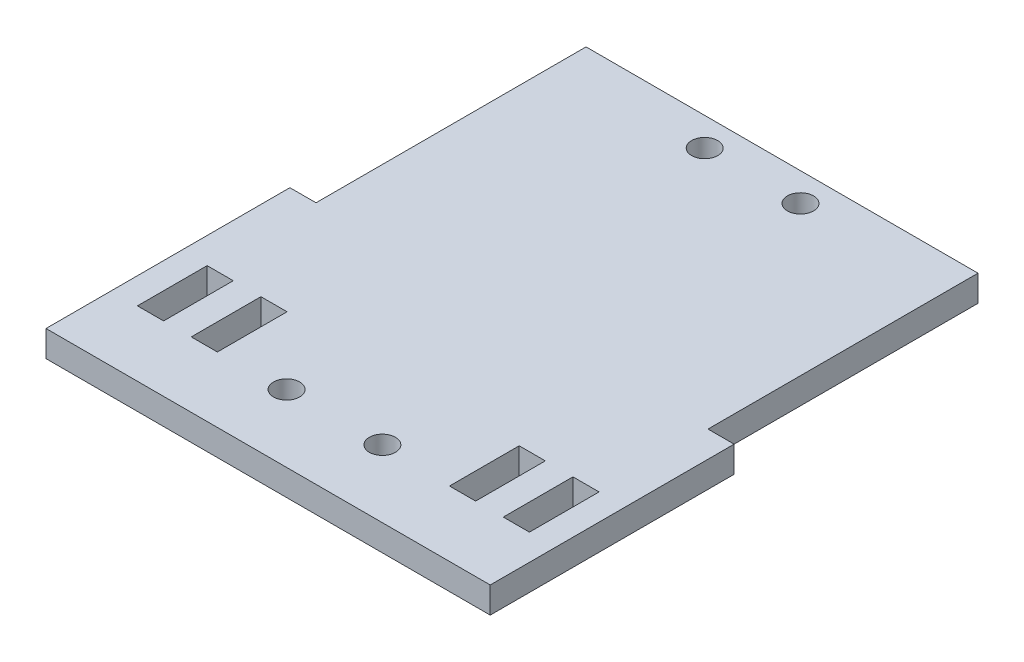
ISO-10303-21;
HEADER;
FILE_DESCRIPTION(('STEP AP214'),'2;1');
FILE_NAME('part.step','',(''),(''),'','','');
FILE_SCHEMA(('AUTOMOTIVE_DESIGN { 1 0 10303 214 1 1 1 1 }'));
ENDSEC;
DATA;
#1=APPLICATION_CONTEXT('core data for automotive mechanical design processes');
#2=APPLICATION_PROTOCOL_DEFINITION('international standard','automotive_design',2000,#1);
#3=PRODUCT_CONTEXT('',#1,'mechanical');
#4=PRODUCT('Part','Part','',(#3));
#5=PRODUCT_RELATED_PRODUCT_CATEGORY('part','',(#4));
#6=PRODUCT_DEFINITION_FORMATION('','',#4);
#7=PRODUCT_DEFINITION_CONTEXT('part definition',#1,'design');
#8=PRODUCT_DEFINITION('design','',#6,#7);
#9=PRODUCT_DEFINITION_SHAPE('','',#8);
#10=(LENGTH_UNIT() NAMED_UNIT(*) SI_UNIT(.MILLI.,.METRE.));
#11=(NAMED_UNIT(*) PLANE_ANGLE_UNIT() SI_UNIT($,.RADIAN.));
#12=(NAMED_UNIT(*) SI_UNIT($,.STERADIAN.) SOLID_ANGLE_UNIT());
#13=UNCERTAINTY_MEASURE_WITH_UNIT(LENGTH_MEASURE(1.E-05),#10,'distance_accuracy_value','');
#14=(GEOMETRIC_REPRESENTATION_CONTEXT(3) GLOBAL_UNCERTAINTY_ASSIGNED_CONTEXT((#13)) GLOBAL_UNIT_ASSIGNED_CONTEXT((#10,
#11,#12)) REPRESENTATION_CONTEXT('',''));
#15=CARTESIAN_POINT('',(0.,0.,0.));
#16=DIRECTION('',(0.,0.,1.));
#17=DIRECTION('',(1.,0.,0.));
#18=AXIS2_PLACEMENT_3D('',#15,#16,#17);
#19=CARTESIAN_POINT('',(110.,4.,0.));
#20=DIRECTION('',(0.,1.,0.));
#21=DIRECTION('',(0.,0.,1.));
#22=AXIS2_PLACEMENT_3D('',#19,#20,#21);
#23=PLANE('',#22);
#24=DIRECTION('',(0.,0.,-1.));
#25=VECTOR('',#24,1.);
#26=CARTESIAN_POINT('',(4.,4.,-56.));
#27=LINE('',#26,#25);
#28=CARTESIAN_POINT('',(4.00000000000001,4.,0.));
#29=VERTEX_POINT('',#28);
#30=CARTESIAN_POINT('',(4.,4.,-56.));
#31=VERTEX_POINT('',#30);
#32=EDGE_CURVE('E208',#29,#31,#27,.T.);
#33=ORIENTED_EDGE('',*,*,#32,.F.);
#34=DIRECTION('',(1.,0.,0.));
#35=VECTOR('',#34,1.);
#36=CARTESIAN_POINT('',(0.,4.,0.));
#37=LINE('',#36,#35);
#38=CARTESIAN_POINT('',(106.,4.,0.));
#39=VERTEX_POINT('',#38);
#40=EDGE_CURVE('E220',#29,#39,#37,.T.);
#41=ORIENTED_EDGE('',*,*,#40,.T.);
#42=DIRECTION('',(0.,0.,1.));
#43=VECTOR('',#42,1.);
#44=CARTESIAN_POINT('',(106.,4.,-56.));
#45=LINE('',#44,#43);
#46=CARTESIAN_POINT('',(106.,4.,-56.));
#47=VERTEX_POINT('',#46);
#48=EDGE_CURVE('E224',#47,#39,#45,.T.);
#49=ORIENTED_EDGE('',*,*,#48,.F.);
#50=DIRECTION('',(1.,0.,0.));
#51=VECTOR('',#50,1.);
#52=CARTESIAN_POINT('',(100.,4.,-56.));
#53=LINE('',#52,#51);
#54=CARTESIAN_POINT('',(100.,4.,-56.));
#55=VERTEX_POINT('',#54);
#56=EDGE_CURVE('E258',#55,#47,#53,.T.);
#57=ORIENTED_EDGE('',*,*,#56,.F.);
#58=DIRECTION('',(0.,0.,1.));
#59=VECTOR('',#58,1.);
#60=CARTESIAN_POINT('',(100.,4.,-56.));
#61=LINE('',#60,#59);
#62=CARTESIAN_POINT('',(100.,4.,-118.));
#63=VERTEX_POINT('',#62);
#64=EDGE_CURVE('E377',#63,#55,#61,.T.);
#65=ORIENTED_EDGE('',*,*,#64,.F.);
#66=DIRECTION('',(-1.,0.,0.));
#67=VECTOR('',#66,1.);
#68=CARTESIAN_POINT('',(0.,4.,-118.));
#69=LINE('',#68,#67);
#70=CARTESIAN_POINT('',(10.,4.,-118.));
#71=VERTEX_POINT('',#70);
#72=EDGE_CURVE('E228',#63,#71,#69,.T.);
#73=ORIENTED_EDGE('',*,*,#72,.T.);
#74=DIRECTION('',(0.,0.,-1.));
#75=VECTOR('',#74,1.);
#76=CARTESIAN_POINT('',(10.,4.,-118.));
#77=LINE('',#76,#75);
#78=CARTESIAN_POINT('',(10.,4.,-56.));
#79=VERTEX_POINT('',#78);
#80=EDGE_CURVE('E400',#79,#71,#77,.T.);
#81=ORIENTED_EDGE('',*,*,#80,.F.);
#82=DIRECTION('',(1.,0.,0.));
#83=VECTOR('',#82,1.);
#84=CARTESIAN_POINT('',(0.,4.,-56.));
#85=LINE('',#84,#83);
#86=EDGE_CURVE('E222',#31,#79,#85,.T.);
#87=ORIENTED_EDGE('',*,*,#86,.F.);
#88=EDGE_LOOP('',(#33,#41,#49,#57,#65,#73,#81,#87));
#89=FACE_BOUND('',#88,.T.);
#90=DIRECTION('',(0.,0.,1.));
#91=VECTOR('',#90,1.);
#92=CARTESIAN_POINT('',(94.,4.,-31.));
#93=LINE('',#92,#91);
#94=CARTESIAN_POINT('',(94.,4.,-31.));
#95=VERTEX_POINT('',#94);
#96=CARTESIAN_POINT('',(94.,4.,-15.));
#97=VERTEX_POINT('',#96);
#98=EDGE_CURVE('E349',#95,#97,#93,.T.);
#99=ORIENTED_EDGE('',*,*,#98,.F.);
#100=DIRECTION('',(-1.,0.,0.));
#101=VECTOR('',#100,1.);
#102=CARTESIAN_POINT('',(94.,4.,-31.));
#103=LINE('',#102,#101);
#104=CARTESIAN_POINT('',(100.,4.,-31.));
#105=VERTEX_POINT('',#104);
#106=EDGE_CURVE('E367',#105,#95,#103,.T.);
#107=ORIENTED_EDGE('',*,*,#106,.F.);
#108=DIRECTION('',(0.,0.,-1.));
#109=VECTOR('',#108,1.);
#110=CARTESIAN_POINT('',(100.,4.,-31.));
#111=LINE('',#110,#109);
#112=CARTESIAN_POINT('',(100.,4.,-15.));
#113=VERTEX_POINT('',#112);
#114=EDGE_CURVE('E381',#113,#105,#111,.T.);
#115=ORIENTED_EDGE('',*,*,#114,.F.);
#116=DIRECTION('',(1.,0.,0.));
#117=VECTOR('',#116,1.);
#118=CARTESIAN_POINT('',(94.,4.,-15.));
#119=LINE('',#118,#117);
#120=EDGE_CURVE('E385',#97,#113,#119,.T.);
#121=ORIENTED_EDGE('',*,*,#120,.F.);
#122=EDGE_LOOP('',(#99,#107,#115,#121));
#123=FACE_BOUND('',#122,.T.);
#124=DIRECTION('',(0.,0.,1.));
#125=VECTOR('',#124,1.);
#126=CARTESIAN_POINT('',(81.65,4.,-31.));
#127=LINE('',#126,#125);
#128=CARTESIAN_POINT('',(81.65,4.,-31.));
#129=VERTEX_POINT('',#128);
#130=CARTESIAN_POINT('',(81.65,4.,-15.));
#131=VERTEX_POINT('',#130);
#132=EDGE_CURVE('E321',#129,#131,#127,.T.);
#133=ORIENTED_EDGE('',*,*,#132,.F.);
#134=DIRECTION('',(-1.,0.,0.));
#135=VECTOR('',#134,1.);
#136=CARTESIAN_POINT('',(81.65,4.,-31.));
#137=LINE('',#136,#135);
#138=CARTESIAN_POINT('',(87.65,4.,-31.));
#139=VERTEX_POINT('',#138);
#140=EDGE_CURVE('E339',#139,#129,#137,.T.);
#141=ORIENTED_EDGE('',*,*,#140,.F.);
#142=DIRECTION('',(0.,0.,-1.));
#143=VECTOR('',#142,1.);
#144=CARTESIAN_POINT('',(87.65,4.,-31.));
#145=LINE('',#144,#143);
#146=CARTESIAN_POINT('',(87.65,4.,-15.));
#147=VERTEX_POINT('',#146);
#148=EDGE_CURVE('E353',#147,#139,#145,.T.);
#149=ORIENTED_EDGE('',*,*,#148,.F.);
#150=DIRECTION('',(1.,0.,0.));
#151=VECTOR('',#150,1.);
#152=CARTESIAN_POINT('',(81.65,4.,-15.));
#153=LINE('',#152,#151);
#154=EDGE_CURVE('E357',#131,#147,#153,.T.);
#155=ORIENTED_EDGE('',*,*,#154,.F.);
#156=EDGE_LOOP('',(#133,#141,#149,#155));
#157=FACE_BOUND('',#156,.T.);
#158=DIRECTION('',(0.,0.,1.));
#159=VECTOR('',#158,1.);
#160=CARTESIAN_POINT('',(22.35,4.,-31.));
#161=LINE('',#160,#159);
#162=CARTESIAN_POINT('',(22.35,4.,-31.));
#163=VERTEX_POINT('',#162);
#164=CARTESIAN_POINT('',(22.35,4.,-15.));
#165=VERTEX_POINT('',#164);
#166=EDGE_CURVE('E292',#163,#165,#161,.T.);
#167=ORIENTED_EDGE('',*,*,#166,.F.);
#168=DIRECTION('',(-1.,0.,0.));
#169=VECTOR('',#168,1.);
#170=CARTESIAN_POINT('',(22.35,4.,-31.));
#171=LINE('',#170,#169);
#172=CARTESIAN_POINT('',(28.35,4.,-31.));
#173=VERTEX_POINT('',#172);
#174=EDGE_CURVE('E311',#173,#163,#171,.T.);
#175=ORIENTED_EDGE('',*,*,#174,.F.);
#176=DIRECTION('',(0.,0.,-1.));
#177=VECTOR('',#176,1.);
#178=CARTESIAN_POINT('',(28.35,4.,-31.));
#179=LINE('',#178,#177);
#180=CARTESIAN_POINT('',(28.35,4.,-15.));
#181=VERTEX_POINT('',#180);
#182=EDGE_CURVE('E325',#181,#173,#179,.T.);
#183=ORIENTED_EDGE('',*,*,#182,.F.);
#184=DIRECTION('',(1.,0.,0.));
#185=VECTOR('',#184,1.);
#186=CARTESIAN_POINT('',(22.35,4.,-15.));
#187=LINE('',#186,#185);
#188=EDGE_CURVE('E329',#165,#181,#187,.T.);
#189=ORIENTED_EDGE('',*,*,#188,.F.);
#190=EDGE_LOOP('',(#167,#175,#183,#189));
#191=FACE_BOUND('',#190,.T.);
#192=DIRECTION('',(0.,0.,1.));
#193=VECTOR('',#192,1.);
#194=CARTESIAN_POINT('',(10.,4.,-31.));
#195=LINE('',#194,#193);
#196=CARTESIAN_POINT('',(10.,4.,-31.));
#197=VERTEX_POINT('',#196);
#198=CARTESIAN_POINT('',(10.,4.,-15.));
#199=VERTEX_POINT('',#198);
#200=EDGE_CURVE('E304',#197,#199,#195,.T.);
#201=ORIENTED_EDGE('',*,*,#200,.F.);
#202=DIRECTION('',(-1.,0.,0.));
#203=VECTOR('',#202,1.);
#204=CARTESIAN_POINT('',(10.,4.,-31.));
#205=LINE('',#204,#203);
#206=CARTESIAN_POINT('',(16.,4.,-31.));
#207=VERTEX_POINT('',#206);
#208=EDGE_CURVE('E282',#207,#197,#205,.T.);
#209=ORIENTED_EDGE('',*,*,#208,.F.);
#210=DIRECTION('',(0.,0.,-1.));
#211=VECTOR('',#210,1.);
#212=CARTESIAN_POINT('',(16.,4.,-31.));
#213=LINE('',#212,#211);
#214=CARTESIAN_POINT('',(16.,4.,-15.));
#215=VERTEX_POINT('',#214);
#216=EDGE_CURVE('E296',#215,#207,#213,.T.);
#217=ORIENTED_EDGE('',*,*,#216,.F.);
#218=DIRECTION('',(1.,0.,0.));
#219=VECTOR('',#218,1.);
#220=CARTESIAN_POINT('',(10.,4.,-15.));
#221=LINE('',#220,#219);
#222=EDGE_CURVE('E300',#199,#215,#221,.T.);
#223=ORIENTED_EDGE('',*,*,#222,.F.);
#224=EDGE_LOOP('',(#201,#209,#217,#223));
#225=FACE_BOUND('',#224,.T.);
#226=CARTESIAN_POINT('',(43.7468145088074,4.,-15.4936290176147));
#227=DIRECTION('',(0.,-1.,0.));
#228=DIRECTION('',(0.,0.,-1.));
#229=AXIS2_PLACEMENT_3D('',#226,#227,#228);
#230=CIRCLE('',#229,3.00000000000001);
#231=CARTESIAN_POINT('',(43.7468145088074,4.,-18.4936290176147));
#232=VERTEX_POINT('',#231);
#233=EDGE_CURVE('E229',#232,#232,#230,.T.);
#234=ORIENTED_EDGE('',*,*,#233,.T.);
#235=EDGE_LOOP('',(#234));
#236=FACE_BOUND('',#235,.T.);
#237=CARTESIAN_POINT('',(65.7468145088074,4.,-111.493629017615));
#238=DIRECTION('',(0.,-1.,0.));
#239=DIRECTION('',(0.,0.,-1.));
#240=AXIS2_PLACEMENT_3D('',#237,#238,#239);
#241=CIRCLE('',#240,2.99999999999996);
#242=CARTESIAN_POINT('',(65.7468145088074,4.,-114.493629017615));
#243=VERTEX_POINT('',#242);
#244=EDGE_CURVE('E237',#243,#243,#241,.T.);
#245=ORIENTED_EDGE('',*,*,#244,.T.);
#246=EDGE_LOOP('',(#245));
#247=FACE_BOUND('',#246,.T.);
#248=CARTESIAN_POINT('',(43.7468145088074,4.,-111.493629017615));
#249=DIRECTION('',(0.,-1.,0.));
#250=DIRECTION('',(0.,0.,-1.));
#251=AXIS2_PLACEMENT_3D('',#248,#249,#250);
#252=CIRCLE('',#251,3.00000000000001);
#253=CARTESIAN_POINT('',(43.7468145088074,4.,-114.493629017615));
#254=VERTEX_POINT('',#253);
#255=EDGE_CURVE('E411',#254,#254,#252,.T.);
#256=ORIENTED_EDGE('',*,*,#255,.T.);
#257=EDGE_LOOP('',(#256));
#258=FACE_BOUND('',#257,.T.);
#259=CARTESIAN_POINT('',(65.7468145088074,4.,-15.4936290176147));
#260=DIRECTION('',(0.,-1.,0.));
#261=DIRECTION('',(0.,0.,-1.));
#262=AXIS2_PLACEMENT_3D('',#259,#260,#261);
#263=CIRCLE('',#262,2.99999999999998);
#264=CARTESIAN_POINT('',(65.7468145088074,4.,-18.4936290176147));
#265=VERTEX_POINT('',#264);
#266=EDGE_CURVE('E406',#265,#265,#263,.T.);
#267=ORIENTED_EDGE('',*,*,#266,.T.);
#268=EDGE_LOOP('',(#267));
#269=FACE_BOUND('',#268,.T.);
#270=ADVANCED_FACE('F47',(#89,#123,#157,#191,#225,#236,#247,#258,#269),#23,.T.);
#271=CARTESIAN_POINT('',(0.,4.,0.));
#272=DIRECTION('',(0.,0.,-1.));
#273=DIRECTION('',(-1.,0.,0.));
#274=AXIS2_PLACEMENT_3D('',#271,#272,#273);
#275=PLANE('',#274);
#276=ORIENTED_EDGE('',*,*,#40,.F.);
#277=DIRECTION('',(0.,1.,0.));
#278=VECTOR('',#277,1.);
#279=CARTESIAN_POINT('',(4.00000000000001,-6.,0.));
#280=LINE('',#279,#278);
#281=CARTESIAN_POINT('',(4.00000000000001,-2.,0.));
#282=VERTEX_POINT('',#281);
#283=EDGE_CURVE('E205',#282,#29,#280,.T.);
#284=ORIENTED_EDGE('',*,*,#283,.F.);
#285=DIRECTION('',(-1.,0.,0.));
#286=VECTOR('',#285,1.);
#287=CARTESIAN_POINT('',(0.,-2.,0.));
#288=LINE('',#287,#286);
#289=CARTESIAN_POINT('',(106.,-2.,0.));
#290=VERTEX_POINT('',#289);
#291=EDGE_CURVE('E268',#290,#282,#288,.T.);
#292=ORIENTED_EDGE('',*,*,#291,.F.);
#293=DIRECTION('',(0.,1.,0.));
#294=VECTOR('',#293,1.);
#295=CARTESIAN_POINT('',(106.,-6.,0.));
#296=LINE('',#295,#294);
#297=EDGE_CURVE('E62',#290,#39,#296,.T.);
#298=ORIENTED_EDGE('',*,*,#297,.T.);
#299=EDGE_LOOP('',(#276,#284,#292,#298));
#300=FACE_BOUND('',#299,.T.);
#301=ADVANCED_FACE('F226',(#300),#275,.F.);
#302=CARTESIAN_POINT('',(0.,4.,-118.));
#303=DIRECTION('',(0.,0.,1.));
#304=DIRECTION('',(1.,0.,0.));
#305=AXIS2_PLACEMENT_3D('',#302,#303,#304);
#306=PLANE('',#305);
#307=ORIENTED_EDGE('',*,*,#72,.F.);
#308=DIRECTION('',(0.,-1.,0.));
#309=VECTOR('',#308,1.);
#310=CARTESIAN_POINT('',(100.,4.,-118.));
#311=LINE('',#310,#309);
#312=CARTESIAN_POINT('',(100.,-2.,-118.));
#313=VERTEX_POINT('',#312);
#314=EDGE_CURVE('E244',#63,#313,#311,.T.);
#315=ORIENTED_EDGE('',*,*,#314,.T.);
#316=DIRECTION('',(1.,0.,0.));
#317=VECTOR('',#316,1.);
#318=CARTESIAN_POINT('',(10.,-2.,-118.));
#319=LINE('',#318,#317);
#320=CARTESIAN_POINT('',(10.,-2.,-118.));
#321=VERTEX_POINT('',#320);
#322=EDGE_CURVE('E274',#321,#313,#319,.T.);
#323=ORIENTED_EDGE('',*,*,#322,.F.);
#324=DIRECTION('',(0.,1.,0.));
#325=VECTOR('',#324,1.);
#326=CARTESIAN_POINT('',(10.,4.,-118.));
#327=LINE('',#326,#325);
#328=EDGE_CURVE('E234',#321,#71,#327,.T.);
#329=ORIENTED_EDGE('',*,*,#328,.T.);
#330=EDGE_LOOP('',(#307,#315,#323,#329));
#331=FACE_BOUND('',#330,.T.);
#332=ADVANCED_FACE('F537',(#331),#306,.F.);
#333=CARTESIAN_POINT('',(65.7468145088074,8.,-15.4936290176147));
#334=DIRECTION('',(0.,-1.,0.));
#335=DIRECTION('',(0.,0.,-1.));
#336=AXIS2_PLACEMENT_3D('',#333,#334,#335);
#337=CYLINDRICAL_SURFACE('',#336,2.99999999999998);
#338=ORIENTED_EDGE('',*,*,#266,.F.);
#339=EDGE_LOOP('',(#338));
#340=FACE_BOUND('',#339,.T.);
#341=CARTESIAN_POINT('',(65.7468145088074,-2.,-15.4936290176147));
#342=DIRECTION('',(0.,-1.,0.));
#343=DIRECTION('',(0.,0.,-1.));
#344=AXIS2_PLACEMENT_3D('',#341,#342,#343);
#345=CIRCLE('',#344,2.99999999999998);
#346=CARTESIAN_POINT('',(65.7468145088074,-2.,-18.4936290176147));
#347=VERTEX_POINT('',#346);
#348=EDGE_CURVE('E440',#347,#347,#345,.F.);
#349=ORIENTED_EDGE('',*,*,#348,.F.);
#350=EDGE_LOOP('',(#349));
#351=FACE_BOUND('',#350,.T.);
#352=ADVANCED_FACE('F535',(#340,#351),#337,.F.);
#353=CARTESIAN_POINT('',(43.7468145088074,8.,-111.493629017615));
#354=DIRECTION('',(0.,-1.,0.));
#355=DIRECTION('',(0.,0.,-1.));
#356=AXIS2_PLACEMENT_3D('',#353,#354,#355);
#357=CYLINDRICAL_SURFACE('',#356,3.00000000000001);
#358=ORIENTED_EDGE('',*,*,#255,.F.);
#359=EDGE_LOOP('',(#358));
#360=FACE_BOUND('',#359,.T.);
#361=CARTESIAN_POINT('',(43.7468145088074,-2.,-111.493629017615));
#362=DIRECTION('',(0.,-1.,0.));
#363=DIRECTION('',(0.,0.,-1.));
#364=AXIS2_PLACEMENT_3D('',#361,#362,#363);
#365=CIRCLE('',#364,3.00000000000001);
#366=CARTESIAN_POINT('',(43.7468145088074,-2.,-114.493629017615));
#367=VERTEX_POINT('',#366);
#368=EDGE_CURVE('E431',#367,#367,#365,.F.);
#369=ORIENTED_EDGE('',*,*,#368,.F.);
#370=EDGE_LOOP('',(#369));
#371=FACE_BOUND('',#370,.T.);
#372=ADVANCED_FACE('F424',(#360,#371),#357,.F.);
#373=CARTESIAN_POINT('',(65.7468145088074,8.,-111.493629017615));
#374=DIRECTION('',(0.,-1.,0.));
#375=DIRECTION('',(0.,0.,-1.));
#376=AXIS2_PLACEMENT_3D('',#373,#374,#375);
#377=CYLINDRICAL_SURFACE('',#376,2.99999999999996);
#378=ORIENTED_EDGE('',*,*,#244,.F.);
#379=EDGE_LOOP('',(#378));
#380=FACE_BOUND('',#379,.T.);
#381=CARTESIAN_POINT('',(65.7468145088074,-2.,-111.493629017615));
#382=DIRECTION('',(0.,-1.,0.));
#383=DIRECTION('',(0.,0.,-1.));
#384=AXIS2_PLACEMENT_3D('',#381,#382,#383);
#385=CIRCLE('',#384,2.99999999999996);
#386=CARTESIAN_POINT('',(65.7468145088074,-2.,-114.493629017615));
#387=VERTEX_POINT('',#386);
#388=EDGE_CURVE('E428',#387,#387,#385,.F.);
#389=ORIENTED_EDGE('',*,*,#388,.F.);
#390=EDGE_LOOP('',(#389));
#391=FACE_BOUND('',#390,.T.);
#392=ADVANCED_FACE('F420',(#380,#391),#377,.F.);
#393=CARTESIAN_POINT('',(43.7468145088074,8.,-15.4936290176147));
#394=DIRECTION('',(0.,-1.,0.));
#395=DIRECTION('',(0.,0.,-1.));
#396=AXIS2_PLACEMENT_3D('',#393,#394,#395);
#397=CYLINDRICAL_SURFACE('',#396,3.00000000000001);
#398=ORIENTED_EDGE('',*,*,#233,.F.);
#399=EDGE_LOOP('',(#398));
#400=FACE_BOUND('',#399,.T.);
#401=CARTESIAN_POINT('',(43.7468145088074,-2.,-15.4936290176147));
#402=DIRECTION('',(0.,-1.,0.));
#403=DIRECTION('',(0.,0.,-1.));
#404=AXIS2_PLACEMENT_3D('',#401,#402,#403);
#405=CIRCLE('',#404,3.00000000000002);
#406=CARTESIAN_POINT('',(43.7468145088074,-2.,-18.4936290176147));
#407=VERTEX_POINT('',#406);
#408=EDGE_CURVE('E432',#407,#407,#405,.F.);
#409=ORIENTED_EDGE('',*,*,#408,.F.);
#410=EDGE_LOOP('',(#409));
#411=FACE_BOUND('',#410,.T.);
#412=ADVANCED_FACE('F423',(#400,#411),#397,.F.);
#413=CARTESIAN_POINT('',(10.,-6.,-118.));
#414=DIRECTION('',(1.,0.,0.));
#415=DIRECTION('',(0.,0.,-1.));
#416=AXIS2_PLACEMENT_3D('',#413,#414,#415);
#417=PLANE('',#416);
#418=ORIENTED_EDGE('',*,*,#328,.F.);
#419=DIRECTION('',(0.,0.,-1.));
#420=VECTOR('',#419,1.);
#421=CARTESIAN_POINT('',(10.,-2.,-56.));
#422=LINE('',#421,#420);
#423=CARTESIAN_POINT('',(10.,-2.,-56.));
#424=VERTEX_POINT('',#423);
#425=EDGE_CURVE('E511',#424,#321,#422,.T.);
#426=ORIENTED_EDGE('',*,*,#425,.F.);
#427=DIRECTION('',(0.,1.,0.));
#428=VECTOR('',#427,1.);
#429=CARTESIAN_POINT('',(10.,-6.,-56.));
#430=LINE('',#429,#428);
#431=EDGE_CURVE('E403',#424,#79,#430,.T.);
#432=ORIENTED_EDGE('',*,*,#431,.T.);
#433=ORIENTED_EDGE('',*,*,#80,.T.);
#434=EDGE_LOOP('',(#418,#426,#432,#433));
#435=FACE_BOUND('',#434,.T.);
#436=ADVANCED_FACE('F552',(#435),#417,.F.);
#437=CARTESIAN_POINT('',(0.,-6.,-56.));
#438=DIRECTION('',(0.,0.,1.));
#439=DIRECTION('',(1.,0.,0.));
#440=AXIS2_PLACEMENT_3D('',#437,#438,#439);
#441=PLANE('',#440);
#442=DIRECTION('',(1.,0.,0.));
#443=VECTOR('',#442,1.);
#444=CARTESIAN_POINT('',(0.,-2.,-56.));
#445=LINE('',#444,#443);
#446=CARTESIAN_POINT('',(4.,-2.,-56.));
#447=VERTEX_POINT('',#446);
#448=EDGE_CURVE('E501',#447,#424,#445,.T.);
#449=ORIENTED_EDGE('',*,*,#448,.F.);
#450=DIRECTION('',(0.,1.,0.));
#451=VECTOR('',#450,1.);
#452=CARTESIAN_POINT('',(4.,-6.,-56.));
#453=LINE('',#452,#451);
#454=EDGE_CURVE('E69',#447,#31,#453,.T.);
#455=ORIENTED_EDGE('',*,*,#454,.T.);
#456=ORIENTED_EDGE('',*,*,#86,.T.);
#457=ORIENTED_EDGE('',*,*,#431,.F.);
#458=EDGE_LOOP('',(#449,#455,#456,#457));
#459=FACE_BOUND('',#458,.T.);
#460=ADVANCED_FACE('F556',(#459),#441,.F.);
#461=CARTESIAN_POINT('',(100.,-6.,-56.));
#462=DIRECTION('',(-1.,0.,0.));
#463=DIRECTION('',(0.,0.,1.));
#464=AXIS2_PLACEMENT_3D('',#461,#462,#463);
#465=PLANE('',#464);
#466=DIRECTION('',(0.,1.,0.));
#467=VECTOR('',#466,1.);
#468=CARTESIAN_POINT('',(100.,-6.,-56.));
#469=LINE('',#468,#467);
#470=CARTESIAN_POINT('',(100.,-2.,-56.));
#471=VERTEX_POINT('',#470);
#472=EDGE_CURVE('E272',#471,#55,#469,.T.);
#473=ORIENTED_EDGE('',*,*,#472,.F.);
#474=DIRECTION('',(0.,0.,1.));
#475=VECTOR('',#474,1.);
#476=CARTESIAN_POINT('',(100.,-2.,-56.));
#477=LINE('',#476,#475);
#478=EDGE_CURVE('E266',#313,#471,#477,.T.);
#479=ORIENTED_EDGE('',*,*,#478,.F.);
#480=ORIENTED_EDGE('',*,*,#314,.F.);
#481=ORIENTED_EDGE('',*,*,#64,.T.);
#482=EDGE_LOOP('',(#473,#479,#480,#481));
#483=FACE_BOUND('',#482,.T.);
#484=ADVANCED_FACE('F519',(#483),#465,.F.);
#485=CARTESIAN_POINT('',(100.,-6.,-56.));
#486=DIRECTION('',(0.,0.,1.));
#487=DIRECTION('',(1.,0.,0.));
#488=AXIS2_PLACEMENT_3D('',#485,#486,#487);
#489=PLANE('',#488);
#490=ORIENTED_EDGE('',*,*,#56,.T.);
#491=DIRECTION('',(0.,1.,0.));
#492=VECTOR('',#491,1.);
#493=CARTESIAN_POINT('',(106.,-6.,-56.));
#494=LINE('',#493,#492);
#495=CARTESIAN_POINT('',(106.,-2.,-56.));
#496=VERTEX_POINT('',#495);
#497=EDGE_CURVE('E249',#496,#47,#494,.T.);
#498=ORIENTED_EDGE('',*,*,#497,.F.);
#499=DIRECTION('',(1.,0.,0.));
#500=VECTOR('',#499,1.);
#501=CARTESIAN_POINT('',(100.,-2.,-56.));
#502=LINE('',#501,#500);
#503=EDGE_CURVE('E256',#471,#496,#502,.T.);
#504=ORIENTED_EDGE('',*,*,#503,.F.);
#505=ORIENTED_EDGE('',*,*,#472,.T.);
#506=EDGE_LOOP('',(#490,#498,#504,#505));
#507=FACE_BOUND('',#506,.T.);
#508=ADVANCED_FACE('F255',(#507),#489,.F.);
#509=CARTESIAN_POINT('',(10.,-6.,-31.));
#510=DIRECTION('',(-1.,0.,0.));
#511=DIRECTION('',(0.,0.,1.));
#512=AXIS2_PLACEMENT_3D('',#509,#510,#511);
#513=PLANE('',#512);
#514=DIRECTION('',(0.,1.,0.));
#515=VECTOR('',#514,1.);
#516=CARTESIAN_POINT('',(10.,-6.,-15.));
#517=LINE('',#516,#515);
#518=CARTESIAN_POINT('',(10.,-2.,-15.));
#519=VERTEX_POINT('',#518);
#520=EDGE_CURVE('E278',#519,#199,#517,.T.);
#521=ORIENTED_EDGE('',*,*,#520,.F.);
#522=DIRECTION('',(0.,0.,1.));
#523=VECTOR('',#522,1.);
#524=CARTESIAN_POINT('',(10.,-2.,-31.));
#525=LINE('',#524,#523);
#526=CARTESIAN_POINT('',(10.,-2.,-31.));
#527=VERTEX_POINT('',#526);
#528=EDGE_CURVE('E470',#527,#519,#525,.T.);
#529=ORIENTED_EDGE('',*,*,#528,.F.);
#530=DIRECTION('',(0.,1.,0.));
#531=VECTOR('',#530,1.);
#532=CARTESIAN_POINT('',(10.,-6.,-31.));
#533=LINE('',#532,#531);
#534=EDGE_CURVE('E289',#527,#197,#533,.T.);
#535=ORIENTED_EDGE('',*,*,#534,.T.);
#536=ORIENTED_EDGE('',*,*,#200,.T.);
#537=EDGE_LOOP('',(#521,#529,#535,#536));
#538=FACE_BOUND('',#537,.T.);
#539=ADVANCED_FACE('F571',(#538),#513,.F.);
#540=CARTESIAN_POINT('',(10.,-6.,-31.));
#541=DIRECTION('',(0.,0.,-1.));
#542=DIRECTION('',(-1.,0.,0.));
#543=AXIS2_PLACEMENT_3D('',#540,#541,#542);
#544=PLANE('',#543);
#545=ORIENTED_EDGE('',*,*,#534,.F.);
#546=DIRECTION('',(-1.,0.,0.));
#547=VECTOR('',#546,1.);
#548=CARTESIAN_POINT('',(10.,-2.,-31.));
#549=LINE('',#548,#547);
#550=CARTESIAN_POINT('',(16.,-2.,-31.));
#551=VERTEX_POINT('',#550);
#552=EDGE_CURVE('E466',#551,#527,#549,.T.);
#553=ORIENTED_EDGE('',*,*,#552,.F.);
#554=DIRECTION('',(0.,1.,0.));
#555=VECTOR('',#554,1.);
#556=CARTESIAN_POINT('',(16.,-6.,-31.));
#557=LINE('',#556,#555);
#558=EDGE_CURVE('E286',#551,#207,#557,.T.);
#559=ORIENTED_EDGE('',*,*,#558,.T.);
#560=ORIENTED_EDGE('',*,*,#208,.T.);
#561=EDGE_LOOP('',(#545,#553,#559,#560));
#562=FACE_BOUND('',#561,.T.);
#563=ADVANCED_FACE('F623',(#562),#544,.F.);
#564=CARTESIAN_POINT('',(16.,-6.,-31.));
#565=DIRECTION('',(1.,0.,0.));
#566=DIRECTION('',(0.,0.,-1.));
#567=AXIS2_PLACEMENT_3D('',#564,#565,#566);
#568=PLANE('',#567);
#569=ORIENTED_EDGE('',*,*,#558,.F.);
#570=DIRECTION('',(0.,0.,-1.));
#571=VECTOR('',#570,1.);
#572=CARTESIAN_POINT('',(16.,-2.,-31.));
#573=LINE('',#572,#571);
#574=CARTESIAN_POINT('',(16.,-2.,-15.));
#575=VERTEX_POINT('',#574);
#576=EDGE_CURVE('E461',#575,#551,#573,.T.);
#577=ORIENTED_EDGE('',*,*,#576,.F.);
#578=DIRECTION('',(0.,1.,0.));
#579=VECTOR('',#578,1.);
#580=CARTESIAN_POINT('',(16.,-6.,-15.));
#581=LINE('',#580,#579);
#582=EDGE_CURVE('E283',#575,#215,#581,.T.);
#583=ORIENTED_EDGE('',*,*,#582,.T.);
#584=ORIENTED_EDGE('',*,*,#216,.T.);
#585=EDGE_LOOP('',(#569,#577,#583,#584));
#586=FACE_BOUND('',#585,.T.);
#587=ADVANCED_FACE('F626',(#586),#568,.F.);
#588=CARTESIAN_POINT('',(10.,-6.,-15.));
#589=DIRECTION('',(0.,0.,1.));
#590=DIRECTION('',(1.,0.,0.));
#591=AXIS2_PLACEMENT_3D('',#588,#589,#590);
#592=PLANE('',#591);
#593=ORIENTED_EDGE('',*,*,#582,.F.);
#594=DIRECTION('',(1.,0.,0.));
#595=VECTOR('',#594,1.);
#596=CARTESIAN_POINT('',(10.,-2.,-15.));
#597=LINE('',#596,#595);
#598=EDGE_CURVE('E465',#519,#575,#597,.T.);
#599=ORIENTED_EDGE('',*,*,#598,.F.);
#600=ORIENTED_EDGE('',*,*,#520,.T.);
#601=ORIENTED_EDGE('',*,*,#222,.T.);
#602=EDGE_LOOP('',(#593,#599,#600,#601));
#603=FACE_BOUND('',#602,.T.);
#604=ADVANCED_FACE('F621',(#603),#592,.F.);
#605=CARTESIAN_POINT('',(22.35,-6.,-31.));
#606=DIRECTION('',(-1.,0.,0.));
#607=DIRECTION('',(0.,0.,1.));
#608=AXIS2_PLACEMENT_3D('',#605,#606,#607);
#609=PLANE('',#608);
#610=DIRECTION('',(0.,1.,0.));
#611=VECTOR('',#610,1.);
#612=CARTESIAN_POINT('',(22.35,-6.,-15.));
#613=LINE('',#612,#611);
#614=CARTESIAN_POINT('',(22.35,-2.,-15.));
#615=VERTEX_POINT('',#614);
#616=EDGE_CURVE('E307',#615,#165,#613,.T.);
#617=ORIENTED_EDGE('',*,*,#616,.F.);
#618=DIRECTION('',(0.,0.,1.));
#619=VECTOR('',#618,1.);
#620=CARTESIAN_POINT('',(22.35,-2.,-31.));
#621=LINE('',#620,#619);
#622=CARTESIAN_POINT('',(22.35,-2.,-31.));
#623=VERTEX_POINT('',#622);
#624=EDGE_CURVE('E497',#623,#615,#621,.T.);
#625=ORIENTED_EDGE('',*,*,#624,.F.);
#626=DIRECTION('',(0.,1.,0.));
#627=VECTOR('',#626,1.);
#628=CARTESIAN_POINT('',(22.35,-6.,-31.));
#629=LINE('',#628,#627);
#630=EDGE_CURVE('E318',#623,#163,#629,.T.);
#631=ORIENTED_EDGE('',*,*,#630,.T.);
#632=ORIENTED_EDGE('',*,*,#166,.T.);
#633=EDGE_LOOP('',(#617,#625,#631,#632));
#634=FACE_BOUND('',#633,.T.);
#635=ADVANCED_FACE('F611',(#634),#609,.F.);
#636=CARTESIAN_POINT('',(22.35,-6.,-31.));
#637=DIRECTION('',(0.,0.,-1.));
#638=DIRECTION('',(-1.,0.,0.));
#639=AXIS2_PLACEMENT_3D('',#636,#637,#638);
#640=PLANE('',#639);
#641=ORIENTED_EDGE('',*,*,#630,.F.);
#642=DIRECTION('',(-1.,0.,0.));
#643=VECTOR('',#642,1.);
#644=CARTESIAN_POINT('',(22.35,-2.,-31.));
#645=LINE('',#644,#643);
#646=CARTESIAN_POINT('',(28.35,-2.,-31.));
#647=VERTEX_POINT('',#646);
#648=EDGE_CURVE('E502',#647,#623,#645,.T.);
#649=ORIENTED_EDGE('',*,*,#648,.F.);
#650=DIRECTION('',(0.,1.,0.));
#651=VECTOR('',#650,1.);
#652=CARTESIAN_POINT('',(28.35,-6.,-31.));
#653=LINE('',#652,#651);
#654=EDGE_CURVE('E315',#647,#173,#653,.T.);
#655=ORIENTED_EDGE('',*,*,#654,.T.);
#656=ORIENTED_EDGE('',*,*,#174,.T.);
#657=EDGE_LOOP('',(#641,#649,#655,#656));
#658=FACE_BOUND('',#657,.T.);
#659=ADVANCED_FACE('F607',(#658),#640,.F.);
#660=CARTESIAN_POINT('',(28.35,-6.,-31.));
#661=DIRECTION('',(1.,0.,0.));
#662=DIRECTION('',(0.,0.,-1.));
#663=AXIS2_PLACEMENT_3D('',#660,#661,#662);
#664=PLANE('',#663);
#665=ORIENTED_EDGE('',*,*,#654,.F.);
#666=DIRECTION('',(0.,0.,-1.));
#667=VECTOR('',#666,1.);
#668=CARTESIAN_POINT('',(28.35,-2.,-31.));
#669=LINE('',#668,#667);
#670=CARTESIAN_POINT('',(28.35,-2.,-15.));
#671=VERTEX_POINT('',#670);
#672=EDGE_CURVE('E496',#671,#647,#669,.T.);
#673=ORIENTED_EDGE('',*,*,#672,.F.);
#674=DIRECTION('',(0.,1.,0.));
#675=VECTOR('',#674,1.);
#676=CARTESIAN_POINT('',(28.35,-6.,-15.));
#677=LINE('',#676,#675);
#678=EDGE_CURVE('E312',#671,#181,#677,.T.);
#679=ORIENTED_EDGE('',*,*,#678,.T.);
#680=ORIENTED_EDGE('',*,*,#182,.T.);
#681=EDGE_LOOP('',(#665,#673,#679,#680));
#682=FACE_BOUND('',#681,.T.);
#683=ADVANCED_FACE('F610',(#682),#664,.F.);
#684=CARTESIAN_POINT('',(22.35,-6.,-15.));
#685=DIRECTION('',(0.,0.,1.));
#686=DIRECTION('',(1.,0.,0.));
#687=AXIS2_PLACEMENT_3D('',#684,#685,#686);
#688=PLANE('',#687);
#689=ORIENTED_EDGE('',*,*,#678,.F.);
#690=DIRECTION('',(1.,0.,0.));
#691=VECTOR('',#690,1.);
#692=CARTESIAN_POINT('',(22.35,-2.,-15.));
#693=LINE('',#692,#691);
#694=EDGE_CURVE('E478',#615,#671,#693,.T.);
#695=ORIENTED_EDGE('',*,*,#694,.F.);
#696=ORIENTED_EDGE('',*,*,#616,.T.);
#697=ORIENTED_EDGE('',*,*,#188,.T.);
#698=EDGE_LOOP('',(#689,#695,#696,#697));
#699=FACE_BOUND('',#698,.T.);
#700=ADVANCED_FACE('F605',(#699),#688,.F.);
#701=CARTESIAN_POINT('',(81.65,-6.,-31.));
#702=DIRECTION('',(-1.,0.,0.));
#703=DIRECTION('',(0.,0.,1.));
#704=AXIS2_PLACEMENT_3D('',#701,#702,#703);
#705=PLANE('',#704);
#706=DIRECTION('',(0.,1.,0.));
#707=VECTOR('',#706,1.);
#708=CARTESIAN_POINT('',(81.65,-6.,-15.));
#709=LINE('',#708,#707);
#710=CARTESIAN_POINT('',(81.65,-2.,-15.));
#711=VERTEX_POINT('',#710);
#712=EDGE_CURVE('E335',#711,#131,#709,.T.);
#713=ORIENTED_EDGE('',*,*,#712,.F.);
#714=DIRECTION('',(0.,0.,1.));
#715=VECTOR('',#714,1.);
#716=CARTESIAN_POINT('',(81.65,-2.,-31.));
#717=LINE('',#716,#715);
#718=CARTESIAN_POINT('',(81.65,-2.,-31.));
#719=VERTEX_POINT('',#718);
#720=EDGE_CURVE('E459',#719,#711,#717,.T.);
#721=ORIENTED_EDGE('',*,*,#720,.F.);
#722=DIRECTION('',(0.,1.,0.));
#723=VECTOR('',#722,1.);
#724=CARTESIAN_POINT('',(81.65,-6.,-31.));
#725=LINE('',#724,#723);
#726=EDGE_CURVE('E346',#719,#129,#725,.T.);
#727=ORIENTED_EDGE('',*,*,#726,.T.);
#728=ORIENTED_EDGE('',*,*,#132,.T.);
#729=EDGE_LOOP('',(#713,#721,#727,#728));
#730=FACE_BOUND('',#729,.T.);
#731=ADVANCED_FACE('F595',(#730),#705,.F.);
#732=CARTESIAN_POINT('',(81.65,-6.,-31.));
#733=DIRECTION('',(0.,0.,-1.));
#734=DIRECTION('',(-1.,0.,0.));
#735=AXIS2_PLACEMENT_3D('',#732,#733,#734);
#736=PLANE('',#735);
#737=ORIENTED_EDGE('',*,*,#726,.F.);
#738=DIRECTION('',(-1.,0.,0.));
#739=VECTOR('',#738,1.);
#740=CARTESIAN_POINT('',(81.65,-2.,-31.));
#741=LINE('',#740,#739);
#742=CARTESIAN_POINT('',(87.65,-2.,-31.));
#743=VERTEX_POINT('',#742);
#744=EDGE_CURVE('E483',#743,#719,#741,.T.);
#745=ORIENTED_EDGE('',*,*,#744,.F.);
#746=DIRECTION('',(0.,1.,0.));
#747=VECTOR('',#746,1.);
#748=CARTESIAN_POINT('',(87.65,-6.,-31.));
#749=LINE('',#748,#747);
#750=EDGE_CURVE('E343',#743,#139,#749,.T.);
#751=ORIENTED_EDGE('',*,*,#750,.T.);
#752=ORIENTED_EDGE('',*,*,#140,.T.);
#753=EDGE_LOOP('',(#737,#745,#751,#752));
#754=FACE_BOUND('',#753,.T.);
#755=ADVANCED_FACE('F591',(#754),#736,.F.);
#756=CARTESIAN_POINT('',(87.65,-6.,-31.));
#757=DIRECTION('',(1.,0.,0.));
#758=DIRECTION('',(0.,0.,-1.));
#759=AXIS2_PLACEMENT_3D('',#756,#757,#758);
#760=PLANE('',#759);
#761=ORIENTED_EDGE('',*,*,#750,.F.);
#762=DIRECTION('',(0.,0.,-1.));
#763=VECTOR('',#762,1.);
#764=CARTESIAN_POINT('',(87.65,-2.,-31.));
#765=LINE('',#764,#763);
#766=CARTESIAN_POINT('',(87.65,-2.,-15.));
#767=VERTEX_POINT('',#766);
#768=EDGE_CURVE('E479',#767,#743,#765,.T.);
#769=ORIENTED_EDGE('',*,*,#768,.F.);
#770=DIRECTION('',(0.,1.,0.));
#771=VECTOR('',#770,1.);
#772=CARTESIAN_POINT('',(87.65,-6.,-15.));
#773=LINE('',#772,#771);
#774=EDGE_CURVE('E340',#767,#147,#773,.T.);
#775=ORIENTED_EDGE('',*,*,#774,.T.);
#776=ORIENTED_EDGE('',*,*,#148,.T.);
#777=EDGE_LOOP('',(#761,#769,#775,#776));
#778=FACE_BOUND('',#777,.T.);
#779=ADVANCED_FACE('F594',(#778),#760,.F.);
#780=CARTESIAN_POINT('',(81.65,-6.,-15.));
#781=DIRECTION('',(0.,0.,1.));
#782=DIRECTION('',(1.,0.,0.));
#783=AXIS2_PLACEMENT_3D('',#780,#781,#782);
#784=PLANE('',#783);
#785=ORIENTED_EDGE('',*,*,#774,.F.);
#786=DIRECTION('',(1.,0.,0.));
#787=VECTOR('',#786,1.);
#788=CARTESIAN_POINT('',(81.65,-2.,-15.));
#789=LINE('',#788,#787);
#790=EDGE_CURVE('E474',#711,#767,#789,.T.);
#791=ORIENTED_EDGE('',*,*,#790,.F.);
#792=ORIENTED_EDGE('',*,*,#712,.T.);
#793=ORIENTED_EDGE('',*,*,#154,.T.);
#794=EDGE_LOOP('',(#785,#791,#792,#793));
#795=FACE_BOUND('',#794,.T.);
#796=ADVANCED_FACE('F589',(#795),#784,.F.);
#797=CARTESIAN_POINT('',(94.,-6.,-31.));
#798=DIRECTION('',(-1.,0.,0.));
#799=DIRECTION('',(0.,0.,1.));
#800=AXIS2_PLACEMENT_3D('',#797,#798,#799);
#801=PLANE('',#800);
#802=DIRECTION('',(0.,1.,0.));
#803=VECTOR('',#802,1.);
#804=CARTESIAN_POINT('',(94.,-6.,-15.));
#805=LINE('',#804,#803);
#806=CARTESIAN_POINT('',(94.,-2.,-15.));
#807=VERTEX_POINT('',#806);
#808=EDGE_CURVE('E363',#807,#97,#805,.T.);
#809=ORIENTED_EDGE('',*,*,#808,.F.);
#810=DIRECTION('',(0.,0.,1.));
#811=VECTOR('',#810,1.);
#812=CARTESIAN_POINT('',(94.,-2.,-31.));
#813=LINE('',#812,#811);
#814=CARTESIAN_POINT('',(94.,-2.,-31.));
#815=VERTEX_POINT('',#814);
#816=EDGE_CURVE('E437',#815,#807,#813,.T.);
#817=ORIENTED_EDGE('',*,*,#816,.F.);
#818=DIRECTION('',(0.,1.,0.));
#819=VECTOR('',#818,1.);
#820=CARTESIAN_POINT('',(94.,-6.,-31.));
#821=LINE('',#820,#819);
#822=EDGE_CURVE('E374',#815,#95,#821,.T.);
#823=ORIENTED_EDGE('',*,*,#822,.T.);
#824=ORIENTED_EDGE('',*,*,#98,.T.);
#825=EDGE_LOOP('',(#809,#817,#823,#824));
#826=FACE_BOUND('',#825,.T.);
#827=ADVANCED_FACE('F578',(#826),#801,.F.);
#828=CARTESIAN_POINT('',(94.,-6.,-31.));
#829=DIRECTION('',(0.,0.,-1.));
#830=DIRECTION('',(-1.,0.,0.));
#831=AXIS2_PLACEMENT_3D('',#828,#829,#830);
#832=PLANE('',#831);
#833=ORIENTED_EDGE('',*,*,#822,.F.);
#834=DIRECTION('',(-1.,0.,0.));
#835=VECTOR('',#834,1.);
#836=CARTESIAN_POINT('',(94.,-2.,-31.));
#837=LINE('',#836,#835);
#838=CARTESIAN_POINT('',(100.,-2.,-31.));
#839=VERTEX_POINT('',#838);
#840=EDGE_CURVE('E450',#839,#815,#837,.T.);
#841=ORIENTED_EDGE('',*,*,#840,.F.);
#842=DIRECTION('',(0.,1.,0.));
#843=VECTOR('',#842,1.);
#844=CARTESIAN_POINT('',(100.,-6.,-31.));
#845=LINE('',#844,#843);
#846=EDGE_CURVE('E371',#839,#105,#845,.T.);
#847=ORIENTED_EDGE('',*,*,#846,.T.);
#848=ORIENTED_EDGE('',*,*,#106,.T.);
#849=EDGE_LOOP('',(#833,#841,#847,#848));
#850=FACE_BOUND('',#849,.T.);
#851=ADVANCED_FACE('F574',(#850),#832,.F.);
#852=CARTESIAN_POINT('',(100.,-6.,-31.));
#853=DIRECTION('',(1.,0.,0.));
#854=DIRECTION('',(0.,0.,-1.));
#855=AXIS2_PLACEMENT_3D('',#852,#853,#854);
#856=PLANE('',#855);
#857=ORIENTED_EDGE('',*,*,#846,.F.);
#858=DIRECTION('',(0.,0.,-1.));
#859=VECTOR('',#858,1.);
#860=CARTESIAN_POINT('',(100.,-2.,-31.));
#861=LINE('',#860,#859);
#862=CARTESIAN_POINT('',(100.,-2.,-15.));
#863=VERTEX_POINT('',#862);
#864=EDGE_CURVE('E445',#863,#839,#861,.T.);
#865=ORIENTED_EDGE('',*,*,#864,.F.);
#866=DIRECTION('',(0.,1.,0.));
#867=VECTOR('',#866,1.);
#868=CARTESIAN_POINT('',(100.,-6.,-15.));
#869=LINE('',#868,#867);
#870=EDGE_CURVE('E368',#863,#113,#869,.T.);
#871=ORIENTED_EDGE('',*,*,#870,.T.);
#872=ORIENTED_EDGE('',*,*,#114,.T.);
#873=EDGE_LOOP('',(#857,#865,#871,#872));
#874=FACE_BOUND('',#873,.T.);
#875=ADVANCED_FACE('F577',(#874),#856,.F.);
#876=CARTESIAN_POINT('',(94.,-6.,-15.));
#877=DIRECTION('',(0.,0.,1.));
#878=DIRECTION('',(1.,0.,0.));
#879=AXIS2_PLACEMENT_3D('',#876,#877,#878);
#880=PLANE('',#879);
#881=ORIENTED_EDGE('',*,*,#870,.F.);
#882=DIRECTION('',(1.,0.,0.));
#883=VECTOR('',#882,1.);
#884=CARTESIAN_POINT('',(94.,-2.,-15.));
#885=LINE('',#884,#883);
#886=EDGE_CURVE('E449',#807,#863,#885,.T.);
#887=ORIENTED_EDGE('',*,*,#886,.F.);
#888=ORIENTED_EDGE('',*,*,#808,.T.);
#889=ORIENTED_EDGE('',*,*,#120,.T.);
#890=EDGE_LOOP('',(#881,#887,#888,#889));
#891=FACE_BOUND('',#890,.T.);
#892=ADVANCED_FACE('F582',(#891),#880,.F.);
#893=CARTESIAN_POINT('',(0.,-2.,0.));
#894=DIRECTION('',(0.,-1.,0.));
#895=DIRECTION('',(0.,0.,-1.));
#896=AXIS2_PLACEMENT_3D('',#893,#894,#895);
#897=PLANE('',#896);
#898=DIRECTION('',(0.,0.,1.));
#899=VECTOR('',#898,1.);
#900=CARTESIAN_POINT('',(4.00000000000001,-2.,0.));
#901=LINE('',#900,#899);
#902=EDGE_CURVE('E12',#447,#282,#901,.T.);
#903=ORIENTED_EDGE('',*,*,#902,.F.);
#904=ORIENTED_EDGE('',*,*,#448,.T.);
#905=ORIENTED_EDGE('',*,*,#425,.T.);
#906=ORIENTED_EDGE('',*,*,#322,.T.);
#907=ORIENTED_EDGE('',*,*,#478,.T.);
#908=ORIENTED_EDGE('',*,*,#503,.T.);
#909=DIRECTION('',(0.,0.,-1.));
#910=VECTOR('',#909,1.);
#911=CARTESIAN_POINT('',(106.,-2.,0.));
#912=LINE('',#911,#910);
#913=EDGE_CURVE('E55',#290,#496,#912,.T.);
#914=ORIENTED_EDGE('',*,*,#913,.F.);
#915=ORIENTED_EDGE('',*,*,#291,.T.);
#916=EDGE_LOOP('',(#903,#904,#905,#906,#907,#908,#914,#915));
#917=FACE_BOUND('',#916,.T.);
#918=ORIENTED_EDGE('',*,*,#368,.T.);
#919=EDGE_LOOP('',(#918));
#920=FACE_BOUND('',#919,.T.);
#921=ORIENTED_EDGE('',*,*,#886,.T.);
#922=ORIENTED_EDGE('',*,*,#864,.T.);
#923=ORIENTED_EDGE('',*,*,#840,.T.);
#924=ORIENTED_EDGE('',*,*,#816,.T.);
#925=EDGE_LOOP('',(#921,#922,#923,#924));
#926=FACE_BOUND('',#925,.T.);
#927=ORIENTED_EDGE('',*,*,#790,.T.);
#928=ORIENTED_EDGE('',*,*,#768,.T.);
#929=ORIENTED_EDGE('',*,*,#744,.T.);
#930=ORIENTED_EDGE('',*,*,#720,.T.);
#931=EDGE_LOOP('',(#927,#928,#929,#930));
#932=FACE_BOUND('',#931,.T.);
#933=ORIENTED_EDGE('',*,*,#598,.T.);
#934=ORIENTED_EDGE('',*,*,#576,.T.);
#935=ORIENTED_EDGE('',*,*,#552,.T.);
#936=ORIENTED_EDGE('',*,*,#528,.T.);
#937=EDGE_LOOP('',(#933,#934,#935,#936));
#938=FACE_BOUND('',#937,.T.);
#939=ORIENTED_EDGE('',*,*,#348,.T.);
#940=EDGE_LOOP('',(#939));
#941=FACE_BOUND('',#940,.T.);
#942=ORIENTED_EDGE('',*,*,#408,.T.);
#943=EDGE_LOOP('',(#942));
#944=FACE_BOUND('',#943,.T.);
#945=ORIENTED_EDGE('',*,*,#388,.T.);
#946=EDGE_LOOP('',(#945));
#947=FACE_BOUND('',#946,.T.);
#948=ORIENTED_EDGE('',*,*,#694,.T.);
#949=ORIENTED_EDGE('',*,*,#672,.T.);
#950=ORIENTED_EDGE('',*,*,#648,.T.);
#951=ORIENTED_EDGE('',*,*,#624,.T.);
#952=EDGE_LOOP('',(#948,#949,#950,#951));
#953=FACE_BOUND('',#952,.T.);
#954=ADVANCED_FACE('F262',(#917,#920,#926,#932,#938,#941,#944,#947,#953),#897,.T.);
#955=CARTESIAN_POINT('',(106.,-6.,-56.));
#956=DIRECTION('',(-1.,0.,0.));
#957=DIRECTION('',(0.,0.,1.));
#958=AXIS2_PLACEMENT_3D('',#955,#956,#957);
#959=PLANE('',#958);
#960=ORIENTED_EDGE('',*,*,#913,.T.);
#961=ORIENTED_EDGE('',*,*,#497,.T.);
#962=ORIENTED_EDGE('',*,*,#48,.T.);
#963=ORIENTED_EDGE('',*,*,#297,.F.);
#964=EDGE_LOOP('',(#960,#961,#962,#963));
#965=FACE_BOUND('',#964,.T.);
#966=ADVANCED_FACE('F248',(#965),#959,.F.);
#967=CARTESIAN_POINT('',(4.,-6.,-56.));
#968=DIRECTION('',(1.,0.,0.));
#969=DIRECTION('',(0.,0.,-1.));
#970=AXIS2_PLACEMENT_3D('',#967,#968,#969);
#971=PLANE('',#970);
#972=ORIENTED_EDGE('',*,*,#902,.T.);
#973=ORIENTED_EDGE('',*,*,#283,.T.);
#974=ORIENTED_EDGE('',*,*,#32,.T.);
#975=ORIENTED_EDGE('',*,*,#454,.F.);
#976=EDGE_LOOP('',(#972,#973,#974,#975));
#977=FACE_BOUND('',#976,.T.);
#978=ADVANCED_FACE('F207',(#977),#971,.F.);
#979=CLOSED_SHELL('',(#270,#301,#332,#352,#372,#392,#412,#436,#460,#484,#508,#539,#563,#587,
#604,#635,#659,#683,#700,#731,#755,#779,#796,#827,#851,#875,#892,#954,#966,#978));
#980=MANIFOLD_SOLID_BREP('B2',#979);
#981=ADVANCED_BREP_SHAPE_REPRESENTATION('',(#18,#980),#14);
#982=SHAPE_DEFINITION_REPRESENTATION(#9,#981);
ENDSEC;
END-ISO-10303-21;
